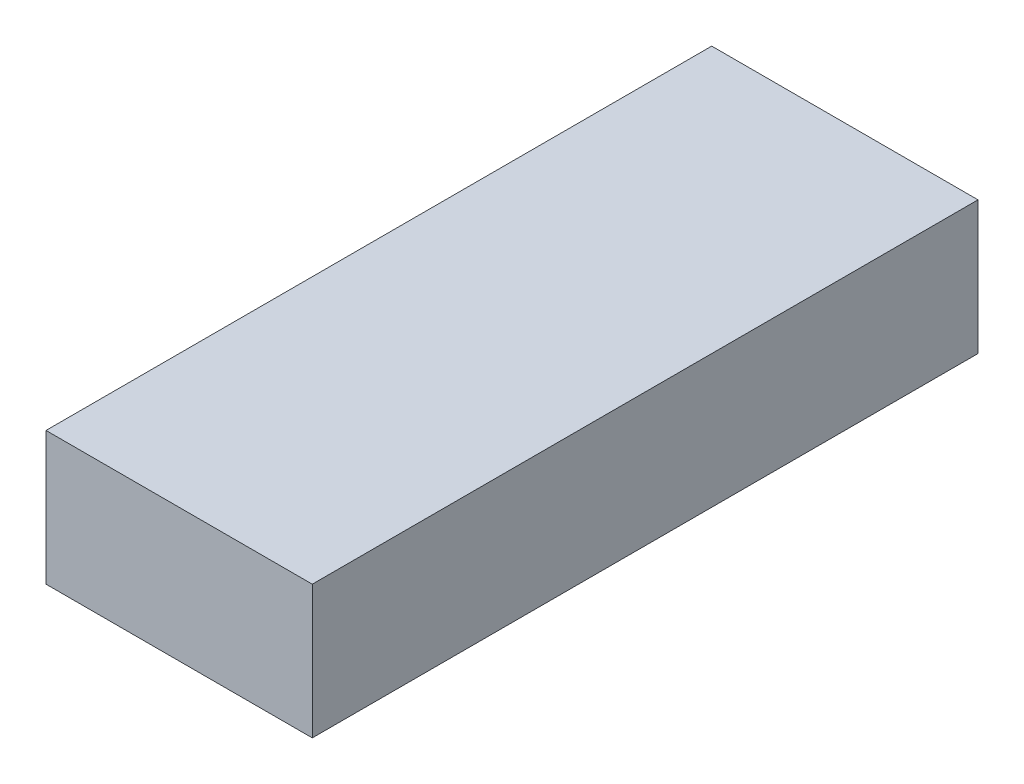
ISO-10303-21;
HEADER;
FILE_DESCRIPTION(('STEP AP214'),'2;1');
FILE_NAME('part.step','',(''),(''),'','','');
FILE_SCHEMA(('AUTOMOTIVE_DESIGN { 1 0 10303 214 1 1 1 1 }'));
ENDSEC;
DATA;
#1=APPLICATION_CONTEXT('core data for automotive mechanical design processes');
#2=APPLICATION_PROTOCOL_DEFINITION('international standard','automotive_design',2000,#1);
#3=PRODUCT_CONTEXT('',#1,'mechanical');
#4=PRODUCT('Part','Part','',(#3));
#5=PRODUCT_RELATED_PRODUCT_CATEGORY('part','',(#4));
#6=PRODUCT_DEFINITION_FORMATION('','',#4);
#7=PRODUCT_DEFINITION_CONTEXT('part definition',#1,'design');
#8=PRODUCT_DEFINITION('design','',#6,#7);
#9=PRODUCT_DEFINITION_SHAPE('','',#8);
#10=(LENGTH_UNIT() NAMED_UNIT(*) SI_UNIT(.MILLI.,.METRE.));
#11=(NAMED_UNIT(*) PLANE_ANGLE_UNIT() SI_UNIT($,.RADIAN.));
#12=(NAMED_UNIT(*) SI_UNIT($,.STERADIAN.) SOLID_ANGLE_UNIT());
#13=UNCERTAINTY_MEASURE_WITH_UNIT(LENGTH_MEASURE(1.E-05),#10,'distance_accuracy_value','');
#14=(GEOMETRIC_REPRESENTATION_CONTEXT(3) GLOBAL_UNCERTAINTY_ASSIGNED_CONTEXT((#13)) GLOBAL_UNIT_ASSIGNED_CONTEXT((#10,
#11,#12)) REPRESENTATION_CONTEXT('',''));
#15=CARTESIAN_POINT('',(0.,0.,0.));
#16=DIRECTION('',(0.,0.,1.));
#17=DIRECTION('',(1.,0.,0.));
#18=AXIS2_PLACEMENT_3D('',#15,#16,#17);
#19=CARTESIAN_POINT('',(0.,3.175,0.));
#20=DIRECTION('',(1.,0.,0.));
#21=DIRECTION('',(0.,0.,-1.));
#22=AXIS2_PLACEMENT_3D('',#19,#20,#21);
#23=PLANE('',#22);
#24=DIRECTION('',(0.,0.,1.));
#25=VECTOR('',#24,1.);
#26=CARTESIAN_POINT('',(0.,0.,0.));
#27=LINE('',#26,#25);
#28=CARTESIAN_POINT('',(0.,0.,-15.875));
#29=VERTEX_POINT('',#28);
#30=CARTESIAN_POINT('',(0.,0.,0.));
#31=VERTEX_POINT('',#30);
#32=EDGE_CURVE('E115',#29,#31,#27,.T.);
#33=ORIENTED_EDGE('',*,*,#32,.T.);
#34=DIRECTION('',(0.,-1.,0.));
#35=VECTOR('',#34,1.);
#36=CARTESIAN_POINT('',(0.,3.175,0.));
#37=LINE('',#36,#35);
#38=CARTESIAN_POINT('',(0.,3.175,0.));
#39=VERTEX_POINT('',#38);
#40=EDGE_CURVE('E11',#39,#31,#37,.T.);
#41=ORIENTED_EDGE('',*,*,#40,.F.);
#42=DIRECTION('',(0.,0.,1.));
#43=VECTOR('',#42,1.);
#44=CARTESIAN_POINT('',(0.,3.175,0.));
#45=LINE('',#44,#43);
#46=CARTESIAN_POINT('',(0.,3.175,-15.875));
#47=VERTEX_POINT('',#46);
#48=EDGE_CURVE('E99',#47,#39,#45,.T.);
#49=ORIENTED_EDGE('',*,*,#48,.F.);
#50=DIRECTION('',(0.,-1.,0.));
#51=VECTOR('',#50,1.);
#52=CARTESIAN_POINT('',(0.,3.175,-15.875));
#53=LINE('',#52,#51);
#54=EDGE_CURVE('E111',#47,#29,#53,.T.);
#55=ORIENTED_EDGE('',*,*,#54,.T.);
#56=EDGE_LOOP('',(#33,#41,#49,#55));
#57=FACE_BOUND('',#56,.T.);
#58=ADVANCED_FACE('F39',(#57),#23,.F.);
#59=CARTESIAN_POINT('',(0.,3.175,0.));
#60=DIRECTION('',(0.,0.,-1.));
#61=DIRECTION('',(-1.,0.,0.));
#62=AXIS2_PLACEMENT_3D('',#59,#60,#61);
#63=PLANE('',#62);
#64=DIRECTION('',(1.,0.,0.));
#65=VECTOR('',#64,1.);
#66=CARTESIAN_POINT('',(0.,0.,0.));
#67=LINE('',#66,#65);
#68=CARTESIAN_POINT('',(6.35,0.,0.));
#69=VERTEX_POINT('',#68);
#70=EDGE_CURVE('E104',#31,#69,#67,.T.);
#71=ORIENTED_EDGE('',*,*,#70,.T.);
#72=DIRECTION('',(0.,-1.,0.));
#73=VECTOR('',#72,1.);
#74=CARTESIAN_POINT('',(6.35,3.175,0.));
#75=LINE('',#74,#73);
#76=CARTESIAN_POINT('',(6.35,3.175,0.));
#77=VERTEX_POINT('',#76);
#78=EDGE_CURVE('E48',#77,#69,#75,.T.);
#79=ORIENTED_EDGE('',*,*,#78,.F.);
#80=DIRECTION('',(1.,0.,0.));
#81=VECTOR('',#80,1.);
#82=CARTESIAN_POINT('',(0.,3.175,0.));
#83=LINE('',#82,#81);
#84=EDGE_CURVE('E93',#39,#77,#83,.T.);
#85=ORIENTED_EDGE('',*,*,#84,.F.);
#86=ORIENTED_EDGE('',*,*,#40,.T.);
#87=EDGE_LOOP('',(#71,#79,#85,#86));
#88=FACE_BOUND('',#87,.T.);
#89=ADVANCED_FACE('F103',(#88),#63,.F.);
#90=CARTESIAN_POINT('',(6.35,3.175,0.));
#91=DIRECTION('',(-1.,0.,0.));
#92=DIRECTION('',(0.,0.,1.));
#93=AXIS2_PLACEMENT_3D('',#90,#91,#92);
#94=PLANE('',#93);
#95=DIRECTION('',(0.,0.,-1.));
#96=VECTOR('',#95,1.);
#97=CARTESIAN_POINT('',(6.35,0.,0.));
#98=LINE('',#97,#96);
#99=CARTESIAN_POINT('',(6.35,0.,-15.875));
#100=VERTEX_POINT('',#99);
#101=EDGE_CURVE('E79',#69,#100,#98,.T.);
#102=ORIENTED_EDGE('',*,*,#101,.T.);
#103=DIRECTION('',(0.,-1.,0.));
#104=VECTOR('',#103,1.);
#105=CARTESIAN_POINT('',(6.35,3.175,-15.875));
#106=LINE('',#105,#104);
#107=CARTESIAN_POINT('',(6.35,3.175,-15.875));
#108=VERTEX_POINT('',#107);
#109=EDGE_CURVE('E106',#108,#100,#106,.T.);
#110=ORIENTED_EDGE('',*,*,#109,.F.);
#111=DIRECTION('',(0.,0.,-1.));
#112=VECTOR('',#111,1.);
#113=CARTESIAN_POINT('',(6.35,3.175,0.));
#114=LINE('',#113,#112);
#115=EDGE_CURVE('E97',#77,#108,#114,.T.);
#116=ORIENTED_EDGE('',*,*,#115,.F.);
#117=ORIENTED_EDGE('',*,*,#78,.T.);
#118=EDGE_LOOP('',(#102,#110,#116,#117));
#119=FACE_BOUND('',#118,.T.);
#120=ADVANCED_FACE('F107',(#119),#94,.F.);
#121=CARTESIAN_POINT('',(0.,3.175,-15.875));
#122=DIRECTION('',(0.,0.,1.));
#123=DIRECTION('',(1.,0.,0.));
#124=AXIS2_PLACEMENT_3D('',#121,#122,#123);
#125=PLANE('',#124);
#126=DIRECTION('',(-1.,0.,0.));
#127=VECTOR('',#126,1.);
#128=CARTESIAN_POINT('',(0.,0.,-15.875));
#129=LINE('',#128,#127);
#130=EDGE_CURVE('E86',#100,#29,#129,.T.);
#131=ORIENTED_EDGE('',*,*,#130,.T.);
#132=ORIENTED_EDGE('',*,*,#54,.F.);
#133=DIRECTION('',(-1.,0.,0.));
#134=VECTOR('',#133,1.);
#135=CARTESIAN_POINT('',(0.,3.175,-15.875));
#136=LINE('',#135,#134);
#137=EDGE_CURVE('E59',#108,#47,#136,.T.);
#138=ORIENTED_EDGE('',*,*,#137,.F.);
#139=ORIENTED_EDGE('',*,*,#109,.T.);
#140=EDGE_LOOP('',(#131,#132,#138,#139));
#141=FACE_BOUND('',#140,.T.);
#142=ADVANCED_FACE('F128',(#141),#125,.F.);
#143=CARTESIAN_POINT('',(0.,3.175,0.));
#144=DIRECTION('',(0.,-1.,0.));
#145=DIRECTION('',(0.,0.,-1.));
#146=AXIS2_PLACEMENT_3D('',#143,#144,#145);
#147=PLANE('',#146);
#148=ORIENTED_EDGE('',*,*,#48,.T.);
#149=ORIENTED_EDGE('',*,*,#84,.T.);
#150=ORIENTED_EDGE('',*,*,#115,.T.);
#151=ORIENTED_EDGE('',*,*,#137,.T.);
#152=EDGE_LOOP('',(#148,#149,#150,#151));
#153=FACE_BOUND('',#152,.T.);
#154=ADVANCED_FACE('F95',(#153),#147,.F.);
#155=CARTESIAN_POINT('',(0.,0.,0.));
#156=DIRECTION('',(0.,-1.,0.));
#157=DIRECTION('',(0.,0.,-1.));
#158=AXIS2_PLACEMENT_3D('',#155,#156,#157);
#159=PLANE('',#158);
#160=ORIENTED_EDGE('',*,*,#32,.F.);
#161=ORIENTED_EDGE('',*,*,#130,.F.);
#162=ORIENTED_EDGE('',*,*,#101,.F.);
#163=ORIENTED_EDGE('',*,*,#70,.F.);
#164=EDGE_LOOP('',(#160,#161,#162,#163));
#165=FACE_BOUND('',#164,.T.);
#166=ADVANCED_FACE('F131',(#165),#159,.T.);
#167=CLOSED_SHELL('',(#58,#89,#120,#142,#154,#166));
#168=MANIFOLD_SOLID_BREP('B2',#167);
#169=ADVANCED_BREP_SHAPE_REPRESENTATION('',(#18,#168),#14);
#170=SHAPE_DEFINITION_REPRESENTATION(#9,#169);
ENDSEC;
END-ISO-10303-21;
